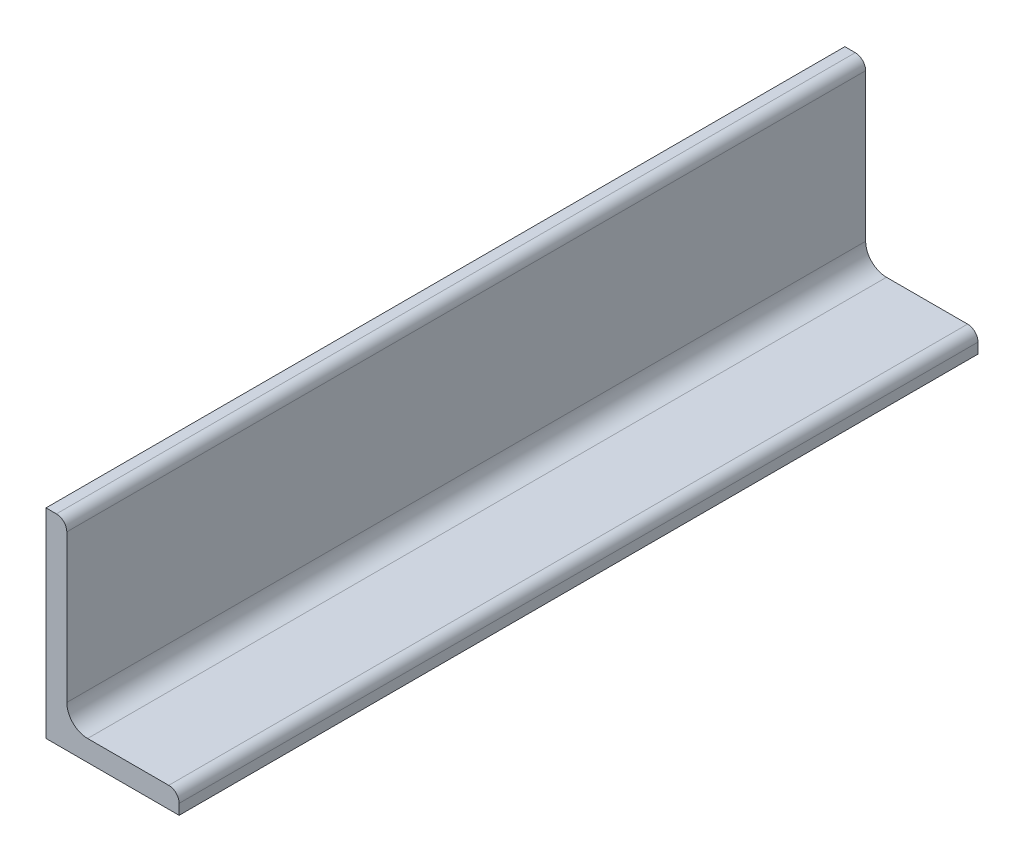
ISO-10303-21;
HEADER;
FILE_DESCRIPTION(('STEP AP214'),'2;1');
FILE_NAME('part.step','',(''),(''),'','','');
FILE_SCHEMA(('AUTOMOTIVE_DESIGN { 1 0 10303 214 1 1 1 1 }'));
ENDSEC;
DATA;
#1=APPLICATION_CONTEXT('core data for automotive mechanical design processes');
#2=APPLICATION_PROTOCOL_DEFINITION('international standard','automotive_design',2000,#1);
#3=PRODUCT_CONTEXT('',#1,'mechanical');
#4=PRODUCT('Part','Part','',(#3));
#5=PRODUCT_RELATED_PRODUCT_CATEGORY('part','',(#4));
#6=PRODUCT_DEFINITION_FORMATION('','',#4);
#7=PRODUCT_DEFINITION_CONTEXT('part definition',#1,'design');
#8=PRODUCT_DEFINITION('design','',#6,#7);
#9=PRODUCT_DEFINITION_SHAPE('','',#8);
#10=(LENGTH_UNIT() NAMED_UNIT(*) SI_UNIT(.MILLI.,.METRE.));
#11=(NAMED_UNIT(*) PLANE_ANGLE_UNIT() SI_UNIT($,.RADIAN.));
#12=(NAMED_UNIT(*) SI_UNIT($,.STERADIAN.) SOLID_ANGLE_UNIT());
#13=UNCERTAINTY_MEASURE_WITH_UNIT(LENGTH_MEASURE(1.E-05),#10,'distance_accuracy_value','');
#14=(GEOMETRIC_REPRESENTATION_CONTEXT(3) GLOBAL_UNCERTAINTY_ASSIGNED_CONTEXT((#13)) GLOBAL_UNIT_ASSIGNED_CONTEXT((#10,
#11,#12)) REPRESENTATION_CONTEXT('',''));
#15=CARTESIAN_POINT('',(0.,0.,0.));
#16=DIRECTION('',(0.,0.,1.));
#17=DIRECTION('',(1.,0.,0.));
#18=AXIS2_PLACEMENT_3D('',#15,#16,#17);
#19=CARTESIAN_POINT('',(0.116507760447575,76.2882459217981,304.8));
#20=DIRECTION('',(1.,0.,0.));
#21=DIRECTION('',(0.,0.,-1.));
#22=AXIS2_PLACEMENT_3D('',#19,#20,#21);
#23=PLANE('',#22);
#24=DIRECTION('',(0.,-1.,0.));
#25=VECTOR('',#24,1.);
#26=CARTESIAN_POINT('',(0.116507760447575,76.2882459217981,0.));
#27=LINE('',#26,#25);
#28=CARTESIAN_POINT('',(0.116507760447575,76.2882459217981,0.));
#29=VERTEX_POINT('',#28);
#30=CARTESIAN_POINT('',(0.116507760447575,0.0882459217980795,0.));
#31=VERTEX_POINT('',#30);
#32=EDGE_CURVE('E135',#29,#31,#27,.T.);
#33=ORIENTED_EDGE('',*,*,#32,.T.);
#34=DIRECTION('',(0.,0.,-1.));
#35=VECTOR('',#34,1.);
#36=CARTESIAN_POINT('',(0.116507760447575,0.0882459217980795,304.8));
#37=LINE('',#36,#35);
#38=CARTESIAN_POINT('',(0.116507760447575,0.0882459217980795,304.8));
#39=VERTEX_POINT('',#38);
#40=EDGE_CURVE('E11',#39,#31,#37,.T.);
#41=ORIENTED_EDGE('',*,*,#40,.F.);
#42=DIRECTION('',(0.,-1.,0.));
#43=VECTOR('',#42,1.);
#44=CARTESIAN_POINT('',(0.116507760447575,76.2882459217981,304.8));
#45=LINE('',#44,#43);
#46=CARTESIAN_POINT('',(0.116507760447575,76.2882459217981,304.8));
#47=VERTEX_POINT('',#46);
#48=EDGE_CURVE('E151',#47,#39,#45,.T.);
#49=ORIENTED_EDGE('',*,*,#48,.F.);
#50=DIRECTION('',(0.,0.,-1.));
#51=VECTOR('',#50,1.);
#52=CARTESIAN_POINT('',(0.116507760447575,76.2882459217981,304.8));
#53=LINE('',#52,#51);
#54=EDGE_CURVE('E131',#47,#29,#53,.T.);
#55=ORIENTED_EDGE('',*,*,#54,.T.);
#56=EDGE_LOOP('',(#33,#41,#49,#55));
#57=FACE_BOUND('',#56,.T.);
#58=ADVANCED_FACE('F33',(#57),#23,.F.);
#59=CARTESIAN_POINT('',(0.116507760447575,0.0882459217980795,304.8));
#60=DIRECTION('',(0.,1.,0.));
#61=DIRECTION('',(0.,0.,1.));
#62=AXIS2_PLACEMENT_3D('',#59,#60,#61);
#63=PLANE('',#62);
#64=DIRECTION('',(1.,0.,0.));
#65=VECTOR('',#64,1.);
#66=CARTESIAN_POINT('',(0.116507760447575,0.0882459217980795,0.));
#67=LINE('',#66,#65);
#68=CARTESIAN_POINT('',(50.9165077604476,0.0882459217980795,0.));
#69=VERTEX_POINT('',#68);
#70=EDGE_CURVE('E138',#31,#69,#67,.T.);
#71=ORIENTED_EDGE('',*,*,#70,.T.);
#72=DIRECTION('',(0.,0.,-1.));
#73=VECTOR('',#72,1.);
#74=CARTESIAN_POINT('',(50.9165077604476,0.0882459217980795,304.8));
#75=LINE('',#74,#73);
#76=CARTESIAN_POINT('',(50.9165077604476,0.0882459217980795,304.8));
#77=VERTEX_POINT('',#76);
#78=EDGE_CURVE('E41',#77,#69,#75,.T.);
#79=ORIENTED_EDGE('',*,*,#78,.F.);
#80=DIRECTION('',(1.,0.,0.));
#81=VECTOR('',#80,1.);
#82=CARTESIAN_POINT('',(0.116507760447575,0.0882459217980795,304.8));
#83=LINE('',#82,#81);
#84=EDGE_CURVE('E95',#39,#77,#83,.T.);
#85=ORIENTED_EDGE('',*,*,#84,.F.);
#86=ORIENTED_EDGE('',*,*,#40,.T.);
#87=EDGE_LOOP('',(#71,#79,#85,#86));
#88=FACE_BOUND('',#87,.T.);
#89=ADVANCED_FACE('F194',(#88),#63,.F.);
#90=CARTESIAN_POINT('',(50.9165077604476,0.0882459217980795,304.8));
#91=DIRECTION('',(-1.,0.,0.));
#92=DIRECTION('',(0.,0.,1.));
#93=AXIS2_PLACEMENT_3D('',#90,#91,#92);
#94=PLANE('',#93);
#95=DIRECTION('',(0.,1.,0.));
#96=VECTOR('',#95,1.);
#97=CARTESIAN_POINT('',(50.9165077604476,0.0882459217980795,0.));
#98=LINE('',#97,#96);
#99=CARTESIAN_POINT('',(50.9165077604476,4.05699592179808,0.));
#100=VERTEX_POINT('',#99);
#101=EDGE_CURVE('E140',#69,#100,#98,.T.);
#102=ORIENTED_EDGE('',*,*,#101,.T.);
#103=DIRECTION('',(0.,0.,-1.));
#104=VECTOR('',#103,1.);
#105=CARTESIAN_POINT('',(50.9165077604476,4.05699592179808,304.8));
#106=LINE('',#105,#104);
#107=CARTESIAN_POINT('',(50.9165077604476,4.05699592179808,304.8));
#108=VERTEX_POINT('',#107);
#109=EDGE_CURVE('E161',#108,#100,#106,.T.);
#110=ORIENTED_EDGE('',*,*,#109,.F.);
#111=DIRECTION('',(0.,1.,0.));
#112=VECTOR('',#111,1.);
#113=CARTESIAN_POINT('',(50.9165077604476,0.0882459217980795,304.8));
#114=LINE('',#113,#112);
#115=EDGE_CURVE('E169',#77,#108,#114,.T.);
#116=ORIENTED_EDGE('',*,*,#115,.F.);
#117=ORIENTED_EDGE('',*,*,#78,.T.);
#118=EDGE_LOOP('',(#102,#110,#116,#117));
#119=FACE_BOUND('',#118,.T.);
#120=ADVANCED_FACE('F167',(#119),#94,.F.);
#121=CARTESIAN_POINT('',(46.9477577604476,4.05699592179808,304.8));
#122=DIRECTION('',(0.,0.,-1.));
#123=DIRECTION('',(-1.,0.,0.));
#124=AXIS2_PLACEMENT_3D('',#121,#122,#123);
#125=CYLINDRICAL_SURFACE('',#124,3.96875);
#126=CARTESIAN_POINT('',(46.9477577604476,4.05699592179808,0.));
#127=DIRECTION('',(0.,0.,1.));
#128=DIRECTION('',(1.,0.,0.));
#129=AXIS2_PLACEMENT_3D('',#126,#127,#128);
#130=CIRCLE('',#129,3.96875);
#131=CARTESIAN_POINT('',(46.9477577604476,8.02574592179808,0.));
#132=VERTEX_POINT('',#131);
#133=EDGE_CURVE('E142',#100,#132,#130,.T.);
#134=ORIENTED_EDGE('',*,*,#133,.T.);
#135=DIRECTION('',(0.,0.,-1.));
#136=VECTOR('',#135,1.);
#137=CARTESIAN_POINT('',(46.9477577604476,8.02574592179808,304.8));
#138=LINE('',#137,#136);
#139=CARTESIAN_POINT('',(46.9477577604476,8.02574592179808,304.8));
#140=VERTEX_POINT('',#139);
#141=EDGE_CURVE('E158',#140,#132,#138,.T.);
#142=ORIENTED_EDGE('',*,*,#141,.F.);
#143=CARTESIAN_POINT('',(46.9477577604476,4.05699592179808,304.8));
#144=DIRECTION('',(0.,0.,1.));
#145=DIRECTION('',(1.,0.,0.));
#146=AXIS2_PLACEMENT_3D('',#143,#144,#145);
#147=CIRCLE('',#146,3.96875);
#148=EDGE_CURVE('E185',#108,#140,#147,.T.);
#149=ORIENTED_EDGE('',*,*,#148,.F.);
#150=ORIENTED_EDGE('',*,*,#109,.T.);
#151=EDGE_LOOP('',(#134,#142,#149,#150));
#152=FACE_BOUND('',#151,.T.);
#153=ADVANCED_FACE('F178',(#152),#125,.T.);
#154=CARTESIAN_POINT('',(46.9477577604476,8.02574592179808,304.8));
#155=DIRECTION('',(0.,-1.,0.));
#156=DIRECTION('',(0.,0.,-1.));
#157=AXIS2_PLACEMENT_3D('',#154,#155,#156);
#158=PLANE('',#157);
#159=DIRECTION('',(-1.,0.,0.));
#160=VECTOR('',#159,1.);
#161=CARTESIAN_POINT('',(46.9477577604476,8.02574592179808,0.));
#162=LINE('',#161,#160);
#163=CARTESIAN_POINT('',(15.9915077604476,8.02574592179808,0.));
#164=VERTEX_POINT('',#163);
#165=EDGE_CURVE('E144',#132,#164,#162,.T.);
#166=ORIENTED_EDGE('',*,*,#165,.T.);
#167=DIRECTION('',(0.,0.,-1.));
#168=VECTOR('',#167,1.);
#169=CARTESIAN_POINT('',(15.9915077604476,8.02574592179808,304.8));
#170=LINE('',#169,#168);
#171=CARTESIAN_POINT('',(15.9915077604476,8.02574592179808,304.8));
#172=VERTEX_POINT('',#171);
#173=EDGE_CURVE('E155',#172,#164,#170,.T.);
#174=ORIENTED_EDGE('',*,*,#173,.F.);
#175=DIRECTION('',(-1.,0.,0.));
#176=VECTOR('',#175,1.);
#177=CARTESIAN_POINT('',(46.9477577604476,8.02574592179808,304.8));
#178=LINE('',#177,#176);
#179=EDGE_CURVE('E184',#140,#172,#178,.T.);
#180=ORIENTED_EDGE('',*,*,#179,.F.);
#181=ORIENTED_EDGE('',*,*,#141,.T.);
#182=EDGE_LOOP('',(#166,#174,#180,#181));
#183=FACE_BOUND('',#182,.T.);
#184=ADVANCED_FACE('F182',(#183),#158,.F.);
#185=CARTESIAN_POINT('',(15.9915077604476,15.9632459217981,304.8));
#186=DIRECTION('',(0.,0.,-1.));
#187=DIRECTION('',(-1.,0.,0.));
#188=AXIS2_PLACEMENT_3D('',#185,#186,#187);
#189=CYLINDRICAL_SURFACE('',#188,7.93749999999999);
#190=CARTESIAN_POINT('',(15.9915077604476,15.9632459217981,0.));
#191=DIRECTION('',(0.,0.,-1.));
#192=DIRECTION('',(1.,0.,0.));
#193=AXIS2_PLACEMENT_3D('',#190,#191,#192);
#194=CIRCLE('',#193,7.93749999999999);
#195=CARTESIAN_POINT('',(8.05400776044758,15.9632459217981,0.));
#196=VERTEX_POINT('',#195);
#197=EDGE_CURVE('E146',#164,#196,#194,.T.);
#198=ORIENTED_EDGE('',*,*,#197,.T.);
#199=DIRECTION('',(0.,0.,-1.));
#200=VECTOR('',#199,1.);
#201=CARTESIAN_POINT('',(8.05400776044758,15.9632459217981,304.8));
#202=LINE('',#201,#200);
#203=CARTESIAN_POINT('',(8.05400776044758,15.9632459217981,304.8));
#204=VERTEX_POINT('',#203);
#205=EDGE_CURVE('E126',#204,#196,#202,.T.);
#206=ORIENTED_EDGE('',*,*,#205,.F.);
#207=CARTESIAN_POINT('',(15.9915077604476,15.9632459217981,304.8));
#208=DIRECTION('',(0.,0.,-1.));
#209=DIRECTION('',(1.,0.,0.));
#210=AXIS2_PLACEMENT_3D('',#207,#208,#209);
#211=CIRCLE('',#210,7.93749999999999);
#212=EDGE_CURVE('E117',#172,#204,#211,.T.);
#213=ORIENTED_EDGE('',*,*,#212,.F.);
#214=ORIENTED_EDGE('',*,*,#173,.T.);
#215=EDGE_LOOP('',(#198,#206,#213,#214));
#216=FACE_BOUND('',#215,.T.);
#217=ADVANCED_FACE('F206',(#216),#189,.F.);
#218=CARTESIAN_POINT('',(8.05400776044758,15.9632459217981,304.8));
#219=DIRECTION('',(-1.,0.,0.));
#220=DIRECTION('',(0.,0.,1.));
#221=AXIS2_PLACEMENT_3D('',#218,#219,#220);
#222=PLANE('',#221);
#223=DIRECTION('',(0.,1.,0.));
#224=VECTOR('',#223,1.);
#225=CARTESIAN_POINT('',(8.05400776044758,15.9632459217981,0.));
#226=LINE('',#225,#224);
#227=CARTESIAN_POINT('',(8.05400776044758,72.3194959217981,0.));
#228=VERTEX_POINT('',#227);
#229=EDGE_CURVE('E125',#196,#228,#226,.T.);
#230=ORIENTED_EDGE('',*,*,#229,.T.);
#231=DIRECTION('',(0.,0.,-1.));
#232=VECTOR('',#231,1.);
#233=CARTESIAN_POINT('',(8.05400776044758,72.3194959217981,304.8));
#234=LINE('',#233,#232);
#235=CARTESIAN_POINT('',(8.05400776044758,72.3194959217981,304.8));
#236=VERTEX_POINT('',#235);
#237=EDGE_CURVE('E122',#236,#228,#234,.T.);
#238=ORIENTED_EDGE('',*,*,#237,.F.);
#239=DIRECTION('',(0.,1.,0.));
#240=VECTOR('',#239,1.);
#241=CARTESIAN_POINT('',(8.05400776044758,15.9632459217981,304.8));
#242=LINE('',#241,#240);
#243=EDGE_CURVE('E111',#204,#236,#242,.T.);
#244=ORIENTED_EDGE('',*,*,#243,.F.);
#245=ORIENTED_EDGE('',*,*,#205,.T.);
#246=EDGE_LOOP('',(#230,#238,#244,#245));
#247=FACE_BOUND('',#246,.T.);
#248=ADVANCED_FACE('F123',(#247),#222,.F.);
#249=CARTESIAN_POINT('',(4.08525776044757,72.3194959217981,304.8));
#250=DIRECTION('',(0.,0.,-1.));
#251=DIRECTION('',(-1.,0.,0.));
#252=AXIS2_PLACEMENT_3D('',#249,#250,#251);
#253=CYLINDRICAL_SURFACE('',#252,3.96875);
#254=CARTESIAN_POINT('',(4.08525776044757,72.3194959217981,0.));
#255=DIRECTION('',(0.,0.,1.));
#256=DIRECTION('',(1.,0.,0.));
#257=AXIS2_PLACEMENT_3D('',#254,#255,#256);
#258=CIRCLE('',#257,3.96875);
#259=CARTESIAN_POINT('',(4.08525776044758,76.2882459217981,0.));
#260=VERTEX_POINT('',#259);
#261=EDGE_CURVE('E81',#228,#260,#258,.T.);
#262=ORIENTED_EDGE('',*,*,#261,.T.);
#263=DIRECTION('',(0.,0.,-1.));
#264=VECTOR('',#263,1.);
#265=CARTESIAN_POINT('',(4.08525776044758,76.2882459217981,304.8));
#266=LINE('',#265,#264);
#267=CARTESIAN_POINT('',(4.08525776044758,76.2882459217981,304.8));
#268=VERTEX_POINT('',#267);
#269=EDGE_CURVE('E127',#268,#260,#266,.T.);
#270=ORIENTED_EDGE('',*,*,#269,.F.);
#271=CARTESIAN_POINT('',(4.08525776044757,72.3194959217981,304.8));
#272=DIRECTION('',(0.,0.,1.));
#273=DIRECTION('',(1.,0.,0.));
#274=AXIS2_PLACEMENT_3D('',#271,#272,#273);
#275=CIRCLE('',#274,3.96875);
#276=EDGE_CURVE('E115',#236,#268,#275,.T.);
#277=ORIENTED_EDGE('',*,*,#276,.F.);
#278=ORIENTED_EDGE('',*,*,#237,.T.);
#279=EDGE_LOOP('',(#262,#270,#277,#278));
#280=FACE_BOUND('',#279,.T.);
#281=ADVANCED_FACE('F129',(#280),#253,.T.);
#282=CARTESIAN_POINT('',(4.08525776044758,76.2882459217981,304.8));
#283=DIRECTION('',(0.,-1.,0.));
#284=DIRECTION('',(0.,0.,-1.));
#285=AXIS2_PLACEMENT_3D('',#282,#283,#284);
#286=PLANE('',#285);
#287=DIRECTION('',(-1.,0.,0.));
#288=VECTOR('',#287,1.);
#289=CARTESIAN_POINT('',(4.08525776044758,76.2882459217981,0.));
#290=LINE('',#289,#288);
#291=EDGE_CURVE('E87',#260,#29,#290,.T.);
#292=ORIENTED_EDGE('',*,*,#291,.T.);
#293=ORIENTED_EDGE('',*,*,#54,.F.);
#294=DIRECTION('',(-1.,0.,0.));
#295=VECTOR('',#294,1.);
#296=CARTESIAN_POINT('',(4.08525776044758,76.2882459217981,304.8));
#297=LINE('',#296,#295);
#298=EDGE_CURVE('E49',#268,#47,#297,.T.);
#299=ORIENTED_EDGE('',*,*,#298,.F.);
#300=ORIENTED_EDGE('',*,*,#269,.T.);
#301=EDGE_LOOP('',(#292,#293,#299,#300));
#302=FACE_BOUND('',#301,.T.);
#303=ADVANCED_FACE('F214',(#302),#286,.F.);
#304=CARTESIAN_POINT('',(46.9477577604476,4.05699592179808,304.8));
#305=DIRECTION('',(0.,0.,1.));
#306=DIRECTION('',(1.,0.,0.));
#307=AXIS2_PLACEMENT_3D('',#304,#305,#306);
#308=PLANE('',#307);
#309=ORIENTED_EDGE('',*,*,#48,.T.);
#310=ORIENTED_EDGE('',*,*,#84,.T.);
#311=ORIENTED_EDGE('',*,*,#115,.T.);
#312=ORIENTED_EDGE('',*,*,#148,.T.);
#313=ORIENTED_EDGE('',*,*,#179,.T.);
#314=ORIENTED_EDGE('',*,*,#212,.T.);
#315=ORIENTED_EDGE('',*,*,#243,.T.);
#316=ORIENTED_EDGE('',*,*,#276,.T.);
#317=ORIENTED_EDGE('',*,*,#298,.T.);
#318=EDGE_LOOP('',(#309,#310,#311,#312,#313,#314,#315,#316,#317));
#319=FACE_BOUND('',#318,.T.);
#320=ADVANCED_FACE('F113',(#319),#308,.T.);
#321=CARTESIAN_POINT('',(46.9477577604476,4.05699592179808,0.));
#322=DIRECTION('',(0.,0.,1.));
#323=DIRECTION('',(1.,0.,0.));
#324=AXIS2_PLACEMENT_3D('',#321,#322,#323);
#325=PLANE('',#324);
#326=ORIENTED_EDGE('',*,*,#32,.F.);
#327=ORIENTED_EDGE('',*,*,#291,.F.);
#328=ORIENTED_EDGE('',*,*,#261,.F.);
#329=ORIENTED_EDGE('',*,*,#229,.F.);
#330=ORIENTED_EDGE('',*,*,#197,.F.);
#331=ORIENTED_EDGE('',*,*,#165,.F.);
#332=ORIENTED_EDGE('',*,*,#133,.F.);
#333=ORIENTED_EDGE('',*,*,#101,.F.);
#334=ORIENTED_EDGE('',*,*,#70,.F.);
#335=EDGE_LOOP('',(#326,#327,#328,#329,#330,#331,#332,#333,#334));
#336=FACE_BOUND('',#335,.T.);
#337=ADVANCED_FACE('F173',(#336),#325,.F.);
#338=CLOSED_SHELL('',(#58,#89,#120,#153,#184,#217,#248,#281,#303,#320,#337));
#339=MANIFOLD_SOLID_BREP('B2',#338);
#340=ADVANCED_BREP_SHAPE_REPRESENTATION('',(#18,#339),#14);
#341=SHAPE_DEFINITION_REPRESENTATION(#9,#340);
ENDSEC;
END-ISO-10303-21;
